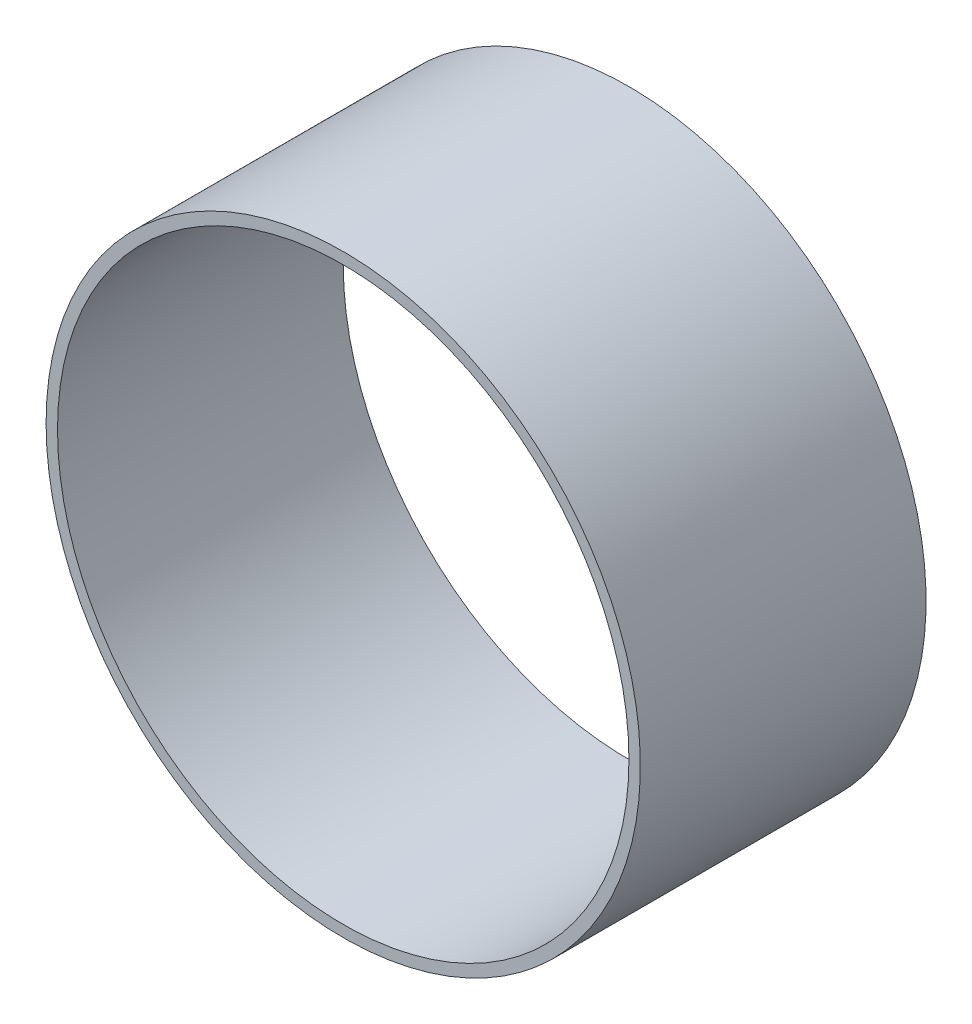
ISO-10303-21;
HEADER;
FILE_DESCRIPTION(('STEP AP214'),'2;1');
FILE_NAME('part.step','',(''),(''),'','','');
FILE_SCHEMA(('AUTOMOTIVE_DESIGN { 1 0 10303 214 1 1 1 1 }'));
ENDSEC;
DATA;
#1=APPLICATION_CONTEXT('core data for automotive mechanical design processes');
#2=APPLICATION_PROTOCOL_DEFINITION('international standard','automotive_design',2000,#1);
#3=PRODUCT_CONTEXT('',#1,'mechanical');
#4=PRODUCT('Part','Part','',(#3));
#5=PRODUCT_RELATED_PRODUCT_CATEGORY('part','',(#4));
#6=PRODUCT_DEFINITION_FORMATION('','',#4);
#7=PRODUCT_DEFINITION_CONTEXT('part definition',#1,'design');
#8=PRODUCT_DEFINITION('design','',#6,#7);
#9=PRODUCT_DEFINITION_SHAPE('','',#8);
#10=(LENGTH_UNIT() NAMED_UNIT(*) SI_UNIT(.MILLI.,.METRE.));
#11=(NAMED_UNIT(*) PLANE_ANGLE_UNIT() SI_UNIT($,.RADIAN.));
#12=(NAMED_UNIT(*) SI_UNIT($,.STERADIAN.) SOLID_ANGLE_UNIT());
#13=UNCERTAINTY_MEASURE_WITH_UNIT(LENGTH_MEASURE(1.E-05),#10,'distance_accuracy_value','');
#14=(GEOMETRIC_REPRESENTATION_CONTEXT(3) GLOBAL_UNCERTAINTY_ASSIGNED_CONTEXT((#13)) GLOBAL_UNIT_ASSIGNED_CONTEXT((#10,
#11,#12)) REPRESENTATION_CONTEXT('',''));
#15=CARTESIAN_POINT('',(0.,0.,0.));
#16=DIRECTION('',(0.,0.,1.));
#17=DIRECTION('',(1.,0.,0.));
#18=AXIS2_PLACEMENT_3D('',#15,#16,#17);
#19=CARTESIAN_POINT('',(0.,0.,38.1));
#20=DIRECTION('',(0.,0.,1.));
#21=DIRECTION('',(1.,0.,0.));
#22=AXIS2_PLACEMENT_3D('',#19,#20,#21);
#23=PLANE('',#22);
#24=CARTESIAN_POINT('',(0.,0.,38.1));
#25=DIRECTION('',(0.,0.,1.));
#26=DIRECTION('',(1.,0.,0.));
#27=AXIS2_PLACEMENT_3D('',#24,#25,#26);
#28=CIRCLE('',#27,39.624);
#29=CARTESIAN_POINT('',(-39.624,0.,38.1));
#30=VERTEX_POINT('',#29);
#31=EDGE_CURVE('E10',#30,#30,#28,.T.);
#32=ORIENTED_EDGE('',*,*,#31,.T.);
#33=EDGE_LOOP('',(#32));
#34=FACE_BOUND('',#33,.T.);
#35=CARTESIAN_POINT('',(0.,0.,38.1));
#36=DIRECTION('',(0.,0.,1.));
#37=DIRECTION('',(1.,0.,0.));
#38=AXIS2_PLACEMENT_3D('',#35,#36,#37);
#39=CIRCLE('',#38,38.1);
#40=CARTESIAN_POINT('',(-38.1,0.,38.1));
#41=VERTEX_POINT('',#40);
#42=EDGE_CURVE('E48',#41,#41,#39,.T.);
#43=ORIENTED_EDGE('',*,*,#42,.F.);
#44=EDGE_LOOP('',(#43));
#45=FACE_BOUND('',#44,.T.);
#46=ADVANCED_FACE('F37',(#34,#45),#23,.T.);
#47=CARTESIAN_POINT('',(0.,0.,0.));
#48=DIRECTION('',(0.,0.,1.));
#49=DIRECTION('',(1.,0.,0.));
#50=AXIS2_PLACEMENT_3D('',#47,#48,#49);
#51=PLANE('',#50);
#52=CARTESIAN_POINT('',(0.,0.,0.));
#53=DIRECTION('',(0.,0.,1.));
#54=DIRECTION('',(1.,0.,0.));
#55=AXIS2_PLACEMENT_3D('',#52,#53,#54);
#56=CIRCLE('',#55,39.624);
#57=CARTESIAN_POINT('',(-39.624,0.,0.));
#58=VERTEX_POINT('',#57);
#59=EDGE_CURVE('E41',#58,#58,#56,.T.);
#60=ORIENTED_EDGE('',*,*,#59,.F.);
#61=EDGE_LOOP('',(#60));
#62=FACE_BOUND('',#61,.T.);
#63=CARTESIAN_POINT('',(0.,0.,0.));
#64=DIRECTION('',(0.,0.,1.));
#65=DIRECTION('',(1.,0.,0.));
#66=AXIS2_PLACEMENT_3D('',#63,#64,#65);
#67=CIRCLE('',#66,38.1);
#68=CARTESIAN_POINT('',(-38.1,0.,0.));
#69=VERTEX_POINT('',#68);
#70=EDGE_CURVE('E50',#69,#69,#67,.T.);
#71=ORIENTED_EDGE('',*,*,#70,.T.);
#72=EDGE_LOOP('',(#71));
#73=FACE_BOUND('',#72,.T.);
#74=ADVANCED_FACE('F60',(#62,#73),#51,.F.);
#75=CARTESIAN_POINT('',(0.,0.,38.1));
#76=DIRECTION('',(0.,0.,-1.));
#77=DIRECTION('',(-1.,0.,0.));
#78=AXIS2_PLACEMENT_3D('',#75,#76,#77);
#79=CYLINDRICAL_SURFACE('',#78,39.624);
#80=CARTESIAN_POINT('',(-39.624,0.,38.1));
#81=CARTESIAN_POINT('',(-39.624,0.,37.703125));
#82=CARTESIAN_POINT('',(-39.624,0.,37.30625));
#83=CARTESIAN_POINT('',(-39.624,0.,36.5125));
#84=CARTESIAN_POINT('',(-39.624,0.,36.115625));
#85=CARTESIAN_POINT('',(-39.624,0.,35.321875));
#86=CARTESIAN_POINT('',(-39.624,0.,34.925));
#87=CARTESIAN_POINT('',(-39.624,0.,34.13125));
#88=CARTESIAN_POINT('',(-39.624,0.,33.734375));
#89=CARTESIAN_POINT('',(-39.624,0.,32.940625));
#90=CARTESIAN_POINT('',(-39.624,0.,32.54375));
#91=CARTESIAN_POINT('',(-39.624,0.,31.75));
#92=CARTESIAN_POINT('',(-39.624,0.,31.353125));
#93=CARTESIAN_POINT('',(-39.624,0.,30.559375));
#94=CARTESIAN_POINT('',(-39.624,0.,30.1625));
#95=CARTESIAN_POINT('',(-39.624,0.,29.36875));
#96=CARTESIAN_POINT('',(-39.624,0.,28.971875));
#97=CARTESIAN_POINT('',(-39.624,0.,28.178125));
#98=CARTESIAN_POINT('',(-39.624,0.,27.78125));
#99=CARTESIAN_POINT('',(-39.624,0.,26.9875));
#100=CARTESIAN_POINT('',(-39.624,0.,26.590625));
#101=CARTESIAN_POINT('',(-39.624,0.,25.796875));
#102=CARTESIAN_POINT('',(-39.624,0.,25.4));
#103=CARTESIAN_POINT('',(-39.624,0.,24.60625));
#104=CARTESIAN_POINT('',(-39.624,0.,24.209375));
#105=CARTESIAN_POINT('',(-39.624,0.,23.415625));
#106=CARTESIAN_POINT('',(-39.624,0.,23.01875));
#107=CARTESIAN_POINT('',(-39.624,0.,22.225));
#108=CARTESIAN_POINT('',(-39.624,0.,21.828125));
#109=CARTESIAN_POINT('',(-39.624,0.,21.034375));
#110=CARTESIAN_POINT('',(-39.624,0.,20.6375));
#111=CARTESIAN_POINT('',(-39.624,0.,19.84375));
#112=CARTESIAN_POINT('',(-39.624,0.,19.446875));
#113=CARTESIAN_POINT('',(-39.624,0.,18.653125));
#114=CARTESIAN_POINT('',(-39.624,0.,18.25625));
#115=CARTESIAN_POINT('',(-39.624,0.,17.4625));
#116=CARTESIAN_POINT('',(-39.624,0.,17.065625));
#117=CARTESIAN_POINT('',(-39.624,0.,16.271875));
#118=CARTESIAN_POINT('',(-39.624,0.,15.875));
#119=CARTESIAN_POINT('',(-39.624,0.,15.08125));
#120=CARTESIAN_POINT('',(-39.624,0.,14.684375));
#121=CARTESIAN_POINT('',(-39.624,0.,13.890625));
#122=CARTESIAN_POINT('',(-39.624,0.,13.49375));
#123=CARTESIAN_POINT('',(-39.624,0.,12.7));
#124=CARTESIAN_POINT('',(-39.624,0.,12.303125));
#125=CARTESIAN_POINT('',(-39.624,0.,11.509375));
#126=CARTESIAN_POINT('',(-39.624,0.,11.1125));
#127=CARTESIAN_POINT('',(-39.624,0.,10.31875));
#128=CARTESIAN_POINT('',(-39.624,0.,9.92187499999999));
#129=CARTESIAN_POINT('',(-39.624,0.,9.128125));
#130=CARTESIAN_POINT('',(-39.624,0.,8.73124999999999));
#131=CARTESIAN_POINT('',(-39.624,0.,7.93749999999999));
#132=CARTESIAN_POINT('',(-39.624,0.,7.54062499999999));
#133=CARTESIAN_POINT('',(-39.624,0.,6.746875));
#134=CARTESIAN_POINT('',(-39.624,0.,6.35));
#135=CARTESIAN_POINT('',(-39.624,0.,5.55625));
#136=CARTESIAN_POINT('',(-39.624,0.,5.159375));
#137=CARTESIAN_POINT('',(-39.624,0.,4.365625));
#138=CARTESIAN_POINT('',(-39.624,0.,3.96875));
#139=CARTESIAN_POINT('',(-39.624,0.,3.175));
#140=CARTESIAN_POINT('',(-39.624,0.,2.778125));
#141=CARTESIAN_POINT('',(-39.624,0.,1.984375));
#142=CARTESIAN_POINT('',(-39.624,0.,1.5875));
#143=CARTESIAN_POINT('',(-39.624,0.,0.79375));
#144=CARTESIAN_POINT('',(-39.624,0.,0.396875));
#145=CARTESIAN_POINT('',(-39.624,0.,0.));
#146=B_SPLINE_CURVE_WITH_KNOTS('',3,(#80,#81,#82,#83,#84,#85,#86,#87,#88,#89,#90,#91,#92,#93,
#94,#95,#96,#97,#98,#99,#100,#101,#102,#103,#104,#105,#106,#107,#108,#109,#110,#111,#112,#113,
#114,#115,#116,#117,#118,#119,#120,#121,#122,#123,#124,#125,#126,#127,#128,#129,#130,#131,#132,
#133,#134,#135,#136,#137,#138,#139,#140,#141,#142,#143,#144,#145),.UNSPECIFIED.,.F.,.F.,(4,2,2,
2,2,2,2,2,2,2,2,2,2,2,2,2,2,2,2,2,2,2,2,2,2,2,2,2,2,2,2,2,4),(0.,1.190625,2.38125,3.571875,
4.7625,5.953125,7.14375,8.334375,9.52500000000001,10.715625,11.90625,13.096875,14.2875,
15.478125,16.66875,17.859375,19.05,20.240625,21.43125,22.621875,23.8125,25.003125,26.19375,
27.384375,28.575,29.765625,30.95625,32.146875,33.3375,34.528125,35.71875,36.909375,38.1),.UNSPECIFIED.);
#147=EDGE_CURVE('BSEAM39',#30,#58,#146,.T.);
#148=ORIENTED_EDGE('',*,*,#31,.F.);
#149=ORIENTED_EDGE('',*,*,#59,.T.);
#150=ORIENTED_EDGE('',*,*,#147,.T.);
#151=ORIENTED_EDGE('',*,*,#147,.F.);
#152=EDGE_LOOP('',(#148,#150,#149,#151));
#153=FACE_BOUND('',#152,.T.);
#154=ADVANCED_FACE('F39',(#153),#79,.T.);
#155=CARTESIAN_POINT('',(0.,0.,38.1));
#156=DIRECTION('',(0.,0.,-1.));
#157=DIRECTION('',(-1.,0.,0.));
#158=AXIS2_PLACEMENT_3D('',#155,#156,#157);
#159=CYLINDRICAL_SURFACE('',#158,38.1);
#160=CARTESIAN_POINT('',(-38.1,0.,38.1));
#161=CARTESIAN_POINT('',(-38.1,0.,37.703125));
#162=CARTESIAN_POINT('',(-38.1,0.,37.30625));
#163=CARTESIAN_POINT('',(-38.1,0.,36.5125));
#164=CARTESIAN_POINT('',(-38.1,0.,36.115625));
#165=CARTESIAN_POINT('',(-38.1,0.,35.321875));
#166=CARTESIAN_POINT('',(-38.1,0.,34.925));
#167=CARTESIAN_POINT('',(-38.1,0.,34.13125));
#168=CARTESIAN_POINT('',(-38.1,0.,33.734375));
#169=CARTESIAN_POINT('',(-38.1,0.,32.940625));
#170=CARTESIAN_POINT('',(-38.1,0.,32.54375));
#171=CARTESIAN_POINT('',(-38.1,0.,31.75));
#172=CARTESIAN_POINT('',(-38.1,0.,31.353125));
#173=CARTESIAN_POINT('',(-38.1,0.,30.559375));
#174=CARTESIAN_POINT('',(-38.1,0.,30.1625));
#175=CARTESIAN_POINT('',(-38.1,0.,29.36875));
#176=CARTESIAN_POINT('',(-38.1,0.,28.971875));
#177=CARTESIAN_POINT('',(-38.1,0.,28.178125));
#178=CARTESIAN_POINT('',(-38.1,0.,27.78125));
#179=CARTESIAN_POINT('',(-38.1,0.,26.9875));
#180=CARTESIAN_POINT('',(-38.1,0.,26.590625));
#181=CARTESIAN_POINT('',(-38.1,0.,25.796875));
#182=CARTESIAN_POINT('',(-38.1,0.,25.4));
#183=CARTESIAN_POINT('',(-38.1,0.,24.60625));
#184=CARTESIAN_POINT('',(-38.1,0.,24.209375));
#185=CARTESIAN_POINT('',(-38.1,0.,23.415625));
#186=CARTESIAN_POINT('',(-38.1,0.,23.01875));
#187=CARTESIAN_POINT('',(-38.1,0.,22.225));
#188=CARTESIAN_POINT('',(-38.1,0.,21.828125));
#189=CARTESIAN_POINT('',(-38.1,0.,21.034375));
#190=CARTESIAN_POINT('',(-38.1,0.,20.6375));
#191=CARTESIAN_POINT('',(-38.1,0.,19.84375));
#192=CARTESIAN_POINT('',(-38.1,0.,19.446875));
#193=CARTESIAN_POINT('',(-38.1,0.,18.653125));
#194=CARTESIAN_POINT('',(-38.1,0.,18.25625));
#195=CARTESIAN_POINT('',(-38.1,0.,17.4625));
#196=CARTESIAN_POINT('',(-38.1,0.,17.065625));
#197=CARTESIAN_POINT('',(-38.1,0.,16.271875));
#198=CARTESIAN_POINT('',(-38.1,0.,15.875));
#199=CARTESIAN_POINT('',(-38.1,0.,15.08125));
#200=CARTESIAN_POINT('',(-38.1,0.,14.684375));
#201=CARTESIAN_POINT('',(-38.1,0.,13.890625));
#202=CARTESIAN_POINT('',(-38.1,0.,13.49375));
#203=CARTESIAN_POINT('',(-38.1,0.,12.7));
#204=CARTESIAN_POINT('',(-38.1,0.,12.303125));
#205=CARTESIAN_POINT('',(-38.1,0.,11.509375));
#206=CARTESIAN_POINT('',(-38.1,0.,11.1125));
#207=CARTESIAN_POINT('',(-38.1,0.,10.31875));
#208=CARTESIAN_POINT('',(-38.1,0.,9.92187499999999));
#209=CARTESIAN_POINT('',(-38.1,0.,9.128125));
#210=CARTESIAN_POINT('',(-38.1,0.,8.73124999999999));
#211=CARTESIAN_POINT('',(-38.1,0.,7.93749999999999));
#212=CARTESIAN_POINT('',(-38.1,0.,7.54062499999999));
#213=CARTESIAN_POINT('',(-38.1,0.,6.746875));
#214=CARTESIAN_POINT('',(-38.1,0.,6.35));
#215=CARTESIAN_POINT('',(-38.1,0.,5.55625));
#216=CARTESIAN_POINT('',(-38.1,0.,5.159375));
#217=CARTESIAN_POINT('',(-38.1,0.,4.365625));
#218=CARTESIAN_POINT('',(-38.1,0.,3.96875));
#219=CARTESIAN_POINT('',(-38.1,0.,3.175));
#220=CARTESIAN_POINT('',(-38.1,0.,2.778125));
#221=CARTESIAN_POINT('',(-38.1,0.,1.984375));
#222=CARTESIAN_POINT('',(-38.1,0.,1.5875));
#223=CARTESIAN_POINT('',(-38.1,0.,0.79375));
#224=CARTESIAN_POINT('',(-38.1,0.,0.396875));
#225=CARTESIAN_POINT('',(-38.1,0.,0.));
#226=B_SPLINE_CURVE_WITH_KNOTS('',3,(#160,#161,#162,#163,#164,#165,#166,#167,#168,#169,#170,
#171,#172,#173,#174,#175,#176,#177,#178,#179,#180,#181,#182,#183,#184,#185,#186,#187,#188,#189,
#190,#191,#192,#193,#194,#195,#196,#197,#198,#199,#200,#201,#202,#203,#204,#205,#206,#207,#208,
#209,#210,#211,#212,#213,#214,#215,#216,#217,#218,#219,#220,#221,#222,#223,#224,#225),
.UNSPECIFIED.,.F.,.F.,(4,2,2,2,2,2,2,2,2,2,2,2,2,2,2,2,2,2,2,2,2,2,2,2,2,2,2,2,2,2,2,2,4),(0.,
1.190625,2.38125,3.571875,4.7625,5.953125,7.14375,8.334375,9.52500000000001,10.715625,11.90625,
13.096875,14.2875,15.478125,16.66875,17.859375,19.05,20.240625,21.43125,22.621875,23.8125,
25.003125,26.19375,27.384375,28.575,29.765625,30.95625,32.146875,33.3375,34.528125,35.71875,
36.909375,38.1),.UNSPECIFIED.);
#227=EDGE_CURVE('BSEAM56',#41,#69,#226,.T.);
#228=ORIENTED_EDGE('',*,*,#42,.T.);
#229=ORIENTED_EDGE('',*,*,#70,.F.);
#230=ORIENTED_EDGE('',*,*,#227,.T.);
#231=ORIENTED_EDGE('',*,*,#227,.F.);
#232=EDGE_LOOP('',(#228,#230,#229,#231));
#233=FACE_BOUND('',#232,.T.);
#234=ADVANCED_FACE('F56',(#233),#159,.F.);
#235=CLOSED_SHELL('',(#46,#74,#154,#234));
#236=MANIFOLD_SOLID_BREP('B2',#235);
#237=ADVANCED_BREP_SHAPE_REPRESENTATION('',(#18,#236),#14);
#238=SHAPE_DEFINITION_REPRESENTATION(#9,#237);
ENDSEC;
END-ISO-10303-21;
